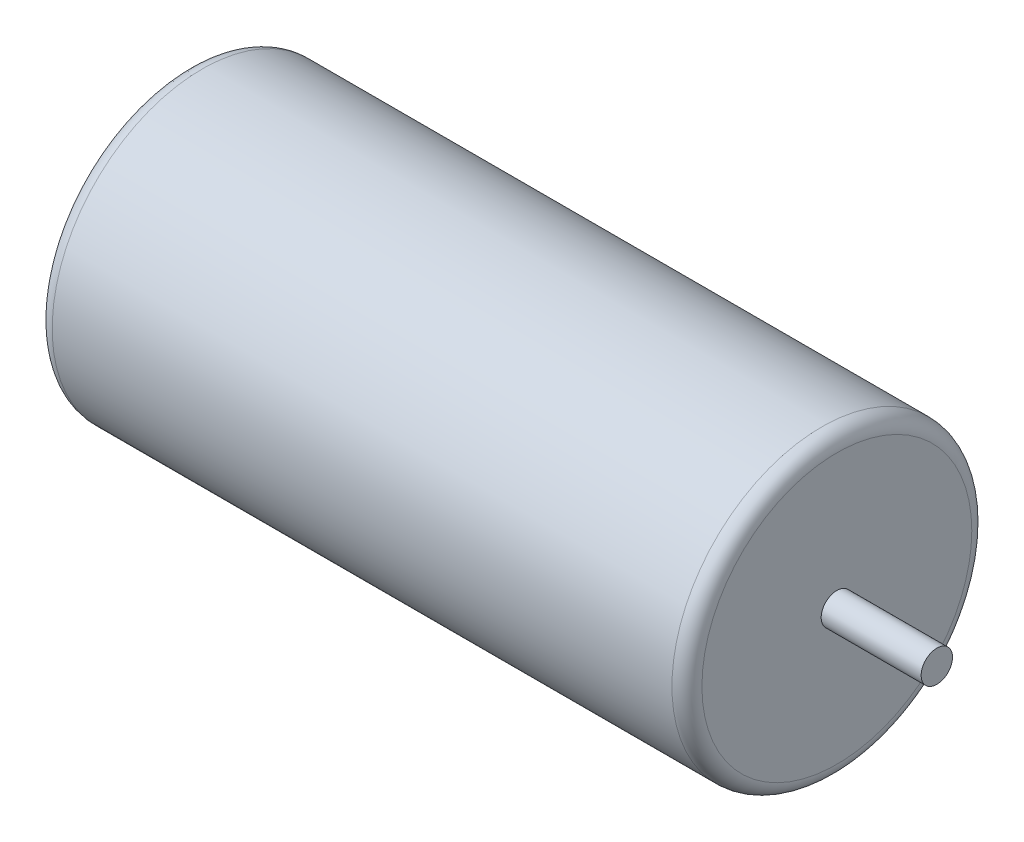
ISO-10303-21;
HEADER;
FILE_DESCRIPTION(('STEP AP214'),'2;1');
FILE_NAME('part.step','',(''),(''),'','','');
FILE_SCHEMA(('AUTOMOTIVE_DESIGN { 1 0 10303 214 1 1 1 1 }'));
ENDSEC;
DATA;
#1=APPLICATION_CONTEXT('core data for automotive mechanical design processes');
#2=APPLICATION_PROTOCOL_DEFINITION('international standard','automotive_design',2000,#1);
#3=PRODUCT_CONTEXT('',#1,'mechanical');
#4=PRODUCT('Part','Part','',(#3));
#5=PRODUCT_RELATED_PRODUCT_CATEGORY('part','',(#4));
#6=PRODUCT_DEFINITION_FORMATION('','',#4);
#7=PRODUCT_DEFINITION_CONTEXT('part definition',#1,'design');
#8=PRODUCT_DEFINITION('design','',#6,#7);
#9=PRODUCT_DEFINITION_SHAPE('','',#8);
#10=(LENGTH_UNIT() NAMED_UNIT(*) SI_UNIT(.MILLI.,.METRE.));
#11=(NAMED_UNIT(*) PLANE_ANGLE_UNIT() SI_UNIT($,.RADIAN.));
#12=(NAMED_UNIT(*) SI_UNIT($,.STERADIAN.) SOLID_ANGLE_UNIT());
#13=UNCERTAINTY_MEASURE_WITH_UNIT(LENGTH_MEASURE(1.E-05),#10,'distance_accuracy_value','');
#14=(GEOMETRIC_REPRESENTATION_CONTEXT(3) GLOBAL_UNCERTAINTY_ASSIGNED_CONTEXT((#13)) GLOBAL_UNIT_ASSIGNED_CONTEXT((#10,
#11,#12)) REPRESENTATION_CONTEXT('',''));
#15=CARTESIAN_POINT('',(0.,0.,0.));
#16=DIRECTION('',(0.,0.,1.));
#17=DIRECTION('',(1.,0.,0.));
#18=AXIS2_PLACEMENT_3D('',#15,#16,#17);
#19=CARTESIAN_POINT('',(165.1,0.,0.));
#20=DIRECTION('',(1.,0.,0.));
#21=DIRECTION('',(0.,0.,-1.));
#22=AXIS2_PLACEMENT_3D('',#19,#20,#21);
#23=PLANE('',#22);
#24=CARTESIAN_POINT('',(165.1,0.,0.));
#25=DIRECTION('',(1.,0.,0.));
#26=DIRECTION('',(0.,0.,-1.));
#27=AXIS2_PLACEMENT_3D('',#24,#25,#26);
#28=CIRCLE('',#27,34.29);
#29=CARTESIAN_POINT('',(165.1,0.,-34.29));
#30=VERTEX_POINT('',#29);
#31=EDGE_CURVE('E52',#30,#30,#28,.T.);
#32=ORIENTED_EDGE('',*,*,#31,.T.);
#33=EDGE_LOOP('',(#32));
#34=FACE_BOUND('',#33,.T.);
#35=CARTESIAN_POINT('',(165.1,0.,0.));
#36=DIRECTION('',(1.,0.,0.));
#37=DIRECTION('',(0.,0.,-1.));
#38=AXIS2_PLACEMENT_3D('',#35,#36,#37);
#39=CIRCLE('',#38,3.9878);
#40=CARTESIAN_POINT('',(165.1,0.,-3.9878));
#41=VERTEX_POINT('',#40);
#42=EDGE_CURVE('E58',#41,#41,#39,.T.);
#43=ORIENTED_EDGE('',*,*,#42,.F.);
#44=EDGE_LOOP('',(#43));
#45=FACE_BOUND('',#44,.T.);
#46=ADVANCED_FACE('F37',(#34,#45),#23,.T.);
#47=CARTESIAN_POINT('',(165.1,0.,0.));
#48=DIRECTION('',(-1.,0.,0.));
#49=DIRECTION('',(0.,0.,1.));
#50=AXIS2_PLACEMENT_3D('',#47,#48,#49);
#51=CYLINDRICAL_SURFACE('',#50,38.1);
#52=CARTESIAN_POINT('',(161.29,0.,0.));
#53=DIRECTION('',(1.,0.,0.));
#54=DIRECTION('',(0.,0.,-1.));
#55=AXIS2_PLACEMENT_3D('',#52,#53,#54);
#56=CIRCLE('',#55,38.1);
#57=CARTESIAN_POINT('',(161.29,0.,-38.1));
#58=VERTEX_POINT('',#57);
#59=EDGE_CURVE('E44',#58,#58,#56,.F.);
#60=ORIENTED_EDGE('',*,*,#59,.T.);
#61=EDGE_LOOP('',(#60));
#62=FACE_BOUND('',#61,.T.);
#63=CARTESIAN_POINT('',(3.81000000000001,0.,0.));
#64=DIRECTION('',(1.,0.,0.));
#65=DIRECTION('',(0.,0.,-1.));
#66=AXIS2_PLACEMENT_3D('',#63,#64,#65);
#67=CIRCLE('',#66,38.1);
#68=CARTESIAN_POINT('',(3.81000000000001,0.,-38.1));
#69=VERTEX_POINT('',#68);
#70=EDGE_CURVE('E48',#69,#69,#67,.T.);
#71=ORIENTED_EDGE('',*,*,#70,.T.);
#72=EDGE_LOOP('',(#71));
#73=FACE_BOUND('',#72,.T.);
#74=ADVANCED_FACE('F86',(#62,#73),#51,.T.);
#75=CARTESIAN_POINT('',(0.,0.,0.));
#76=DIRECTION('',(1.,0.,0.));
#77=DIRECTION('',(0.,0.,-1.));
#78=AXIS2_PLACEMENT_3D('',#75,#76,#77);
#79=PLANE('',#78);
#80=CARTESIAN_POINT('',(0.,0.,0.));
#81=DIRECTION('',(1.,0.,0.));
#82=DIRECTION('',(0.,0.,-1.));
#83=AXIS2_PLACEMENT_3D('',#80,#81,#82);
#84=CIRCLE('',#83,33.02);
#85=CARTESIAN_POINT('',(0.,0.,-33.02));
#86=VERTEX_POINT('',#85);
#87=EDGE_CURVE('E61',#86,#86,#84,.T.);
#88=ORIENTED_EDGE('',*,*,#87,.T.);
#89=EDGE_LOOP('',(#88));
#90=FACE_BOUND('',#89,.T.);
#91=CARTESIAN_POINT('',(0.,0.,0.));
#92=DIRECTION('',(1.,0.,0.));
#93=DIRECTION('',(0.,0.,-1.));
#94=AXIS2_PLACEMENT_3D('',#91,#92,#93);
#95=CIRCLE('',#94,34.29);
#96=CARTESIAN_POINT('',(0.,0.,-34.29));
#97=VERTEX_POINT('',#96);
#98=EDGE_CURVE('E10',#97,#97,#95,.F.);
#99=ORIENTED_EDGE('',*,*,#98,.T.);
#100=EDGE_LOOP('',(#99));
#101=FACE_BOUND('',#100,.T.);
#102=ADVANCED_FACE('F92',(#90,#101),#79,.F.);
#103=CARTESIAN_POINT('',(190.5,0.,0.));
#104=DIRECTION('',(-1.,0.,0.));
#105=DIRECTION('',(0.,0.,1.));
#106=AXIS2_PLACEMENT_3D('',#103,#104,#105);
#107=CYLINDRICAL_SURFACE('',#106,3.9878);
#108=CARTESIAN_POINT('',(190.5,0.,0.));
#109=DIRECTION('',(1.,0.,0.));
#110=DIRECTION('',(0.,0.,-1.));
#111=AXIS2_PLACEMENT_3D('',#108,#109,#110);
#112=CIRCLE('',#111,3.9878);
#113=CARTESIAN_POINT('',(190.5,0.,-3.9878));
#114=VERTEX_POINT('',#113);
#115=EDGE_CURVE('E57',#114,#114,#112,.T.);
#116=ORIENTED_EDGE('',*,*,#115,.F.);
#117=EDGE_LOOP('',(#116));
#118=FACE_BOUND('',#117,.T.);
#119=ORIENTED_EDGE('',*,*,#42,.T.);
#120=EDGE_LOOP('',(#119));
#121=FACE_BOUND('',#120,.T.);
#122=ADVANCED_FACE('F97',(#118,#121),#107,.T.);
#123=CARTESIAN_POINT('',(190.5,0.,0.));
#124=DIRECTION('',(1.,0.,0.));
#125=DIRECTION('',(0.,0.,-1.));
#126=AXIS2_PLACEMENT_3D('',#123,#124,#125);
#127=PLANE('',#126);
#128=ORIENTED_EDGE('',*,*,#115,.T.);
#129=EDGE_LOOP('',(#128));
#130=FACE_BOUND('',#129,.T.);
#131=ADVANCED_FACE('F101',(#130),#127,.T.);
#132=CARTESIAN_POINT('',(161.29,0.,0.));
#133=DIRECTION('',(1.,0.,0.));
#134=DIRECTION('',(0.,0.,-1.));
#135=AXIS2_PLACEMENT_3D('',#132,#133,#134);
#136=TOROIDAL_SURFACE('',#135,34.29,3.81);
#137=ORIENTED_EDGE('',*,*,#59,.F.);
#138=EDGE_LOOP('',(#137));
#139=FACE_BOUND('',#138,.T.);
#140=ORIENTED_EDGE('',*,*,#31,.F.);
#141=EDGE_LOOP('',(#140));
#142=FACE_BOUND('',#141,.T.);
#143=ADVANCED_FACE('F83',(#139,#142),#136,.T.);
#144=CARTESIAN_POINT('',(3.81000000000001,0.,0.));
#145=DIRECTION('',(1.,0.,0.));
#146=DIRECTION('',(0.,0.,-1.));
#147=AXIS2_PLACEMENT_3D('',#144,#145,#146);
#148=TOROIDAL_SURFACE('',#147,34.29,3.81);
#149=ORIENTED_EDGE('',*,*,#98,.F.);
#150=EDGE_LOOP('',(#149));
#151=FACE_BOUND('',#150,.T.);
#152=ORIENTED_EDGE('',*,*,#70,.F.);
#153=EDGE_LOOP('',(#152));
#154=FACE_BOUND('',#153,.T.);
#155=ADVANCED_FACE('F39',(#151,#154),#148,.T.);
#156=CARTESIAN_POINT('',(160.02,0.,0.));
#157=DIRECTION('',(1.,0.,0.));
#158=DIRECTION('',(0.,0.,-1.));
#159=AXIS2_PLACEMENT_3D('',#156,#157,#158);
#160=PLANE('',#159);
#161=CARTESIAN_POINT('',(160.02,0.,0.));
#162=DIRECTION('',(1.,0.,0.));
#163=DIRECTION('',(0.,0.,-1.));
#164=AXIS2_PLACEMENT_3D('',#161,#162,#163);
#165=CIRCLE('',#164,33.02);
#166=CARTESIAN_POINT('',(160.02,0.,-33.02));
#167=VERTEX_POINT('',#166);
#168=EDGE_CURVE('E66',#167,#167,#165,.T.);
#169=ORIENTED_EDGE('',*,*,#168,.F.);
#170=EDGE_LOOP('',(#169));
#171=FACE_BOUND('',#170,.T.);
#172=ADVANCED_FACE('F73',(#171),#160,.F.);
#173=CARTESIAN_POINT('',(165.1,0.,0.));
#174=DIRECTION('',(-1.,0.,0.));
#175=DIRECTION('',(0.,0.,1.));
#176=AXIS2_PLACEMENT_3D('',#173,#174,#175);
#177=CYLINDRICAL_SURFACE('',#176,33.02);
#178=ORIENTED_EDGE('',*,*,#168,.T.);
#179=EDGE_LOOP('',(#178));
#180=FACE_BOUND('',#179,.T.);
#181=ORIENTED_EDGE('',*,*,#87,.F.);
#182=EDGE_LOOP('',(#181));
#183=FACE_BOUND('',#182,.T.);
#184=ADVANCED_FACE('F70',(#180,#183),#177,.F.);
#185=CLOSED_SHELL('',(#46,#74,#102,#122,#131,#143,#155,#172,#184));
#186=MANIFOLD_SOLID_BREP('B2',#185);
#187=ADVANCED_BREP_SHAPE_REPRESENTATION('',(#18,#186),#14);
#188=SHAPE_DEFINITION_REPRESENTATION(#9,#187);
ENDSEC;
END-ISO-10303-21;
